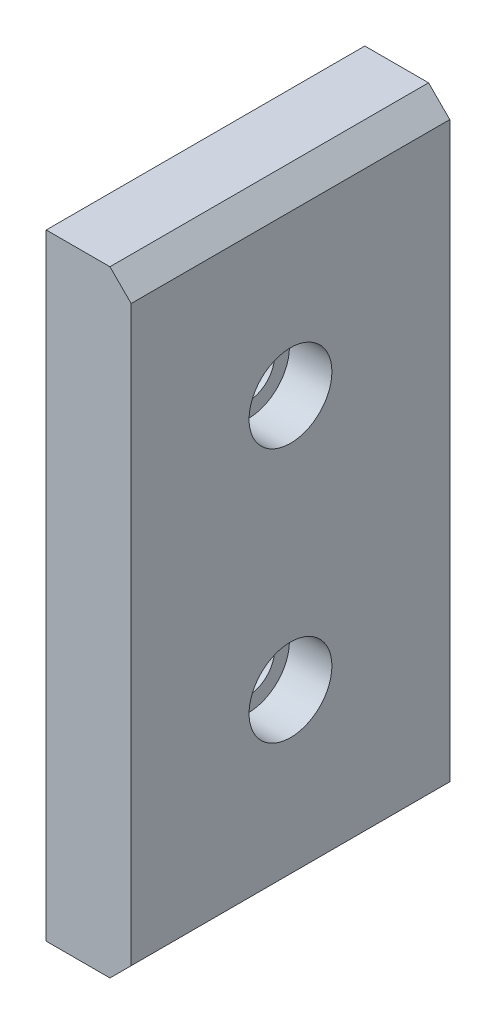
ISO-10303-21;
HEADER;
FILE_DESCRIPTION(('STEP AP214'),'2;1');
FILE_NAME('part.step','',(''),(''),'','','');
FILE_SCHEMA(('AUTOMOTIVE_DESIGN { 1 0 10303 214 1 1 1 1 }'));
ENDSEC;
DATA;
#1=APPLICATION_CONTEXT('core data for automotive mechanical design processes');
#2=APPLICATION_PROTOCOL_DEFINITION('international standard','automotive_design',2000,#1);
#3=PRODUCT_CONTEXT('',#1,'mechanical');
#4=PRODUCT('Part','Part','',(#3));
#5=PRODUCT_RELATED_PRODUCT_CATEGORY('part','',(#4));
#6=PRODUCT_DEFINITION_FORMATION('','',#4);
#7=PRODUCT_DEFINITION_CONTEXT('part definition',#1,'design');
#8=PRODUCT_DEFINITION('design','',#6,#7);
#9=PRODUCT_DEFINITION_SHAPE('','',#8);
#10=(LENGTH_UNIT() NAMED_UNIT(*) SI_UNIT(.MILLI.,.METRE.));
#11=(NAMED_UNIT(*) PLANE_ANGLE_UNIT() SI_UNIT($,.RADIAN.));
#12=(NAMED_UNIT(*) SI_UNIT($,.STERADIAN.) SOLID_ANGLE_UNIT());
#13=UNCERTAINTY_MEASURE_WITH_UNIT(LENGTH_MEASURE(1.E-05),#10,'distance_accuracy_value','');
#14=(GEOMETRIC_REPRESENTATION_CONTEXT(3) GLOBAL_UNCERTAINTY_ASSIGNED_CONTEXT((#13)) GLOBAL_UNIT_ASSIGNED_CONTEXT((#10,
#11,#12)) REPRESENTATION_CONTEXT('',''));
#15=CARTESIAN_POINT('',(0.,0.,0.));
#16=DIRECTION('',(0.,0.,1.));
#17=DIRECTION('',(1.,0.,0.));
#18=AXIS2_PLACEMENT_3D('',#15,#16,#17);
#19=CARTESIAN_POINT('',(4.,6.,0.));
#20=DIRECTION('',(-1.,0.,0.));
#21=DIRECTION('',(0.,0.,1.));
#22=AXIS2_PLACEMENT_3D('',#19,#20,#21);
#23=CYLINDRICAL_SURFACE('',#22,1.25);
#24=CARTESIAN_POINT('',(0.,6.,0.));
#25=DIRECTION('',(1.,0.,0.));
#26=DIRECTION('',(0.,0.,-1.));
#27=AXIS2_PLACEMENT_3D('',#24,#25,#26);
#28=CIRCLE('',#27,1.25);
#29=CARTESIAN_POINT('',(0.,6.,-1.25));
#30=VERTEX_POINT('',#29);
#31=EDGE_CURVE('E116',#30,#30,#28,.T.);
#32=ORIENTED_EDGE('',*,*,#31,.F.);
#33=EDGE_LOOP('',(#32));
#34=FACE_BOUND('',#33,.T.);
#35=CARTESIAN_POINT('',(2.,6.,0.));
#36=DIRECTION('',(1.,0.,0.));
#37=DIRECTION('',(0.,0.,-1.));
#38=AXIS2_PLACEMENT_3D('',#35,#36,#37);
#39=CIRCLE('',#38,1.25);
#40=CARTESIAN_POINT('',(2.,6.,-1.25));
#41=VERTEX_POINT('',#40);
#42=EDGE_CURVE('E136',#41,#41,#39,.T.);
#43=ORIENTED_EDGE('',*,*,#42,.T.);
#44=EDGE_LOOP('',(#43));
#45=FACE_BOUND('',#44,.T.);
#46=ADVANCED_FACE('F37',(#34,#45),#23,.F.);
#47=CARTESIAN_POINT('',(4.,-6.,0.));
#48=DIRECTION('',(-1.,0.,0.));
#49=DIRECTION('',(0.,0.,1.));
#50=AXIS2_PLACEMENT_3D('',#47,#48,#49);
#51=CYLINDRICAL_SURFACE('',#50,1.25);
#52=CARTESIAN_POINT('',(0.,-6.,0.));
#53=DIRECTION('',(1.,0.,0.));
#54=DIRECTION('',(0.,0.,1.));
#55=AXIS2_PLACEMENT_3D('',#52,#53,#54);
#56=CIRCLE('',#55,1.25);
#57=CARTESIAN_POINT('',(0.,-6.,1.25));
#58=VERTEX_POINT('',#57);
#59=EDGE_CURVE('E119',#58,#58,#56,.T.);
#60=ORIENTED_EDGE('',*,*,#59,.F.);
#61=EDGE_LOOP('',(#60));
#62=FACE_BOUND('',#61,.T.);
#63=CARTESIAN_POINT('',(2.,-6.,0.));
#64=DIRECTION('',(1.,0.,0.));
#65=DIRECTION('',(0.,0.,-1.));
#66=AXIS2_PLACEMENT_3D('',#63,#64,#65);
#67=CIRCLE('',#66,1.25);
#68=CARTESIAN_POINT('',(2.,-6.,-1.25));
#69=VERTEX_POINT('',#68);
#70=EDGE_CURVE('E133',#69,#69,#67,.T.);
#71=ORIENTED_EDGE('',*,*,#70,.T.);
#72=EDGE_LOOP('',(#71));
#73=FACE_BOUND('',#72,.T.);
#74=ADVANCED_FACE('F188',(#62,#73),#51,.F.);
#75=CARTESIAN_POINT('',(4.,0.,0.));
#76=DIRECTION('',(1.,0.,0.));
#77=DIRECTION('',(0.,0.,-1.));
#78=AXIS2_PLACEMENT_3D('',#75,#76,#77);
#79=PLANE('',#78);
#80=CARTESIAN_POINT('',(4.,6.,0.));
#81=DIRECTION('',(1.,0.,0.));
#82=DIRECTION('',(0.,0.,-1.));
#83=AXIS2_PLACEMENT_3D('',#80,#81,#82);
#84=CIRCLE('',#83,1.95);
#85=CARTESIAN_POINT('',(4.,6.,-1.95));
#86=VERTEX_POINT('',#85);
#87=EDGE_CURVE('E171',#86,#86,#84,.T.);
#88=ORIENTED_EDGE('',*,*,#87,.F.);
#89=EDGE_LOOP('',(#88));
#90=FACE_BOUND('',#89,.T.);
#91=CARTESIAN_POINT('',(4.,-6.,0.));
#92=DIRECTION('',(1.,0.,0.));
#93=DIRECTION('',(0.,0.,-1.));
#94=AXIS2_PLACEMENT_3D('',#91,#92,#93);
#95=CIRCLE('',#94,1.95);
#96=CARTESIAN_POINT('',(4.,-6.,-1.95));
#97=VERTEX_POINT('',#96);
#98=EDGE_CURVE('E165',#97,#97,#95,.T.);
#99=ORIENTED_EDGE('',*,*,#98,.F.);
#100=EDGE_LOOP('',(#99));
#101=FACE_BOUND('',#100,.T.);
#102=DIRECTION('',(0.,-1.,0.));
#103=VECTOR('',#102,1.);
#104=CARTESIAN_POINT('',(4.,14.5,7.5));
#105=LINE('',#104,#103);
#106=CARTESIAN_POINT('',(4.,13.5,7.5));
#107=VERTEX_POINT('',#106);
#108=CARTESIAN_POINT('',(4.,-13.5,7.5));
#109=VERTEX_POINT('',#108);
#110=EDGE_CURVE('E122',#107,#109,#105,.T.);
#111=ORIENTED_EDGE('',*,*,#110,.T.);
#112=DIRECTION('',(0.,0.,-1.));
#113=VECTOR('',#112,1.);
#114=CARTESIAN_POINT('',(4.,-13.5,-7.5));
#115=LINE('',#114,#113);
#116=CARTESIAN_POINT('',(4.,-13.5,-7.5));
#117=VERTEX_POINT('',#116);
#118=EDGE_CURVE('E142',#109,#117,#115,.T.);
#119=ORIENTED_EDGE('',*,*,#118,.T.);
#120=DIRECTION('',(0.,1.,0.));
#121=VECTOR('',#120,1.);
#122=CARTESIAN_POINT('',(4.,14.5,-7.5));
#123=LINE('',#122,#121);
#124=CARTESIAN_POINT('',(4.,13.5,-7.5));
#125=VERTEX_POINT('',#124);
#126=EDGE_CURVE('E128',#117,#125,#123,.T.);
#127=ORIENTED_EDGE('',*,*,#126,.T.);
#128=DIRECTION('',(0.,0.,1.));
#129=VECTOR('',#128,1.);
#130=CARTESIAN_POINT('',(4.,13.5,7.5));
#131=LINE('',#130,#129);
#132=EDGE_CURVE('E100',#125,#107,#131,.T.);
#133=ORIENTED_EDGE('',*,*,#132,.T.);
#134=EDGE_LOOP('',(#111,#119,#127,#133));
#135=FACE_BOUND('',#134,.T.);
#136=ADVANCED_FACE('F156',(#90,#101,#135),#79,.T.);
#137=CARTESIAN_POINT('',(0.,0.,0.));
#138=DIRECTION('',(1.,0.,0.));
#139=DIRECTION('',(0.,0.,-1.));
#140=AXIS2_PLACEMENT_3D('',#137,#138,#139);
#141=PLANE('',#140);
#142=DIRECTION('',(0.,1.,0.));
#143=VECTOR('',#142,1.);
#144=CARTESIAN_POINT('',(0.,14.5,-7.5));
#145=LINE('',#144,#143);
#146=CARTESIAN_POINT('',(0.,-14.5,-7.5));
#147=VERTEX_POINT('',#146);
#148=CARTESIAN_POINT('',(0.,14.5,-7.5));
#149=VERTEX_POINT('',#148);
#150=EDGE_CURVE('E108',#147,#149,#145,.T.);
#151=ORIENTED_EDGE('',*,*,#150,.F.);
#152=DIRECTION('',(0.,0.,-1.));
#153=VECTOR('',#152,1.);
#154=CARTESIAN_POINT('',(0.,-14.5,7.5));
#155=LINE('',#154,#153);
#156=CARTESIAN_POINT('',(0.,-14.5,7.5));
#157=VERTEX_POINT('',#156);
#158=EDGE_CURVE('E126',#157,#147,#155,.T.);
#159=ORIENTED_EDGE('',*,*,#158,.F.);
#160=DIRECTION('',(0.,-1.,0.));
#161=VECTOR('',#160,1.);
#162=CARTESIAN_POINT('',(0.,14.5,7.5));
#163=LINE('',#162,#161);
#164=CARTESIAN_POINT('',(0.,14.5,7.5));
#165=VERTEX_POINT('',#164);
#166=EDGE_CURVE('E110',#165,#157,#163,.T.);
#167=ORIENTED_EDGE('',*,*,#166,.F.);
#168=DIRECTION('',(0.,0.,1.));
#169=VECTOR('',#168,1.);
#170=CARTESIAN_POINT('',(0.,14.5,7.5));
#171=LINE('',#170,#169);
#172=EDGE_CURVE('E94',#149,#165,#171,.T.);
#173=ORIENTED_EDGE('',*,*,#172,.F.);
#174=EDGE_LOOP('',(#151,#159,#167,#173));
#175=FACE_BOUND('',#174,.T.);
#176=ORIENTED_EDGE('',*,*,#31,.T.);
#177=EDGE_LOOP('',(#176));
#178=FACE_BOUND('',#177,.T.);
#179=ORIENTED_EDGE('',*,*,#59,.T.);
#180=EDGE_LOOP('',(#179));
#181=FACE_BOUND('',#180,.T.);
#182=ADVANCED_FACE('F105',(#175,#178,#181),#141,.F.);
#183=CARTESIAN_POINT('',(4.,14.5,-7.5));
#184=DIRECTION('',(0.,0.,1.));
#185=DIRECTION('',(0.,-1.,0.));
#186=AXIS2_PLACEMENT_3D('',#183,#184,#185);
#187=PLANE('',#186);
#188=ORIENTED_EDGE('',*,*,#126,.F.);
#189=DIRECTION('',(-0.707106781186549,-0.707106781186546,0.));
#190=VECTOR('',#189,1.);
#191=CARTESIAN_POINT('',(4.,-13.5,-7.5));
#192=LINE('',#191,#190);
#193=CARTESIAN_POINT('',(3.,-14.5,-7.5));
#194=VERTEX_POINT('',#193);
#195=EDGE_CURVE('E147',#117,#194,#192,.T.);
#196=ORIENTED_EDGE('',*,*,#195,.T.);
#197=DIRECTION('',(-1.,0.,0.));
#198=VECTOR('',#197,1.);
#199=CARTESIAN_POINT('',(4.,-14.5,-7.5));
#200=LINE('',#199,#198);
#201=EDGE_CURVE('E114',#194,#147,#200,.T.);
#202=ORIENTED_EDGE('',*,*,#201,.T.);
#203=ORIENTED_EDGE('',*,*,#150,.T.);
#204=DIRECTION('',(-1.,0.,0.));
#205=VECTOR('',#204,1.);
#206=CARTESIAN_POINT('',(4.,14.5,-7.5));
#207=LINE('',#206,#205);
#208=CARTESIAN_POINT('',(3.,14.5,-7.5));
#209=VERTEX_POINT('',#208);
#210=EDGE_CURVE('E91',#209,#149,#207,.T.);
#211=ORIENTED_EDGE('',*,*,#210,.F.);
#212=DIRECTION('',(0.707106781186549,-0.707106781186546,0.));
#213=VECTOR('',#212,1.);
#214=CARTESIAN_POINT('',(4.,13.5,-7.5));
#215=LINE('',#214,#213);
#216=EDGE_CURVE('E145',#209,#125,#215,.T.);
#217=ORIENTED_EDGE('',*,*,#216,.T.);
#218=EDGE_LOOP('',(#188,#196,#202,#203,#211,#217));
#219=FACE_BOUND('',#218,.T.);
#220=ADVANCED_FACE('F113',(#219),#187,.F.);
#221=CARTESIAN_POINT('',(4.,14.5,7.5));
#222=DIRECTION('',(0.,-1.,0.));
#223=DIRECTION('',(0.,0.,-1.));
#224=AXIS2_PLACEMENT_3D('',#221,#222,#223);
#225=PLANE('',#224);
#226=DIRECTION('',(-1.,0.,0.));
#227=VECTOR('',#226,1.);
#228=CARTESIAN_POINT('',(4.,14.5,7.5));
#229=LINE('',#228,#227);
#230=CARTESIAN_POINT('',(3.,14.5,7.5));
#231=VERTEX_POINT('',#230);
#232=EDGE_CURVE('E101',#231,#165,#229,.T.);
#233=ORIENTED_EDGE('',*,*,#232,.F.);
#234=DIRECTION('',(0.,0.,-1.));
#235=VECTOR('',#234,1.);
#236=CARTESIAN_POINT('',(3.,14.5,-7.5));
#237=LINE('',#236,#235);
#238=EDGE_CURVE('E11',#231,#209,#237,.T.);
#239=ORIENTED_EDGE('',*,*,#238,.T.);
#240=ORIENTED_EDGE('',*,*,#210,.T.);
#241=ORIENTED_EDGE('',*,*,#172,.T.);
#242=EDGE_LOOP('',(#233,#239,#240,#241));
#243=FACE_BOUND('',#242,.T.);
#244=ADVANCED_FACE('F93',(#243),#225,.F.);
#245=CARTESIAN_POINT('',(4.,14.5,7.5));
#246=DIRECTION('',(0.,0.,-1.));
#247=DIRECTION('',(0.,1.,0.));
#248=AXIS2_PLACEMENT_3D('',#245,#246,#247);
#249=PLANE('',#248);
#250=DIRECTION('',(-1.,0.,0.));
#251=VECTOR('',#250,1.);
#252=CARTESIAN_POINT('',(4.,-14.5,7.5));
#253=LINE('',#252,#251);
#254=CARTESIAN_POINT('',(3.,-14.5,7.5));
#255=VERTEX_POINT('',#254);
#256=EDGE_CURVE('E130',#255,#157,#253,.T.);
#257=ORIENTED_EDGE('',*,*,#256,.F.);
#258=DIRECTION('',(0.707106781186549,0.707106781186546,0.));
#259=VECTOR('',#258,1.);
#260=CARTESIAN_POINT('',(4.,-13.5,7.5));
#261=LINE('',#260,#259);
#262=EDGE_CURVE('E46',#255,#109,#261,.T.);
#263=ORIENTED_EDGE('',*,*,#262,.T.);
#264=ORIENTED_EDGE('',*,*,#110,.F.);
#265=DIRECTION('',(-0.707106781186549,0.707106781186546,0.));
#266=VECTOR('',#265,1.);
#267=CARTESIAN_POINT('',(4.,13.5,7.5));
#268=LINE('',#267,#266);
#269=EDGE_CURVE('E53',#107,#231,#268,.T.);
#270=ORIENTED_EDGE('',*,*,#269,.T.);
#271=ORIENTED_EDGE('',*,*,#232,.T.);
#272=ORIENTED_EDGE('',*,*,#166,.T.);
#273=EDGE_LOOP('',(#257,#263,#264,#270,#271,#272));
#274=FACE_BOUND('',#273,.T.);
#275=ADVANCED_FACE('F152',(#274),#249,.F.);
#276=CARTESIAN_POINT('',(4.,-14.5,7.5));
#277=DIRECTION('',(0.,1.,0.));
#278=DIRECTION('',(0.,0.,1.));
#279=AXIS2_PLACEMENT_3D('',#276,#277,#278);
#280=PLANE('',#279);
#281=ORIENTED_EDGE('',*,*,#201,.F.);
#282=DIRECTION('',(0.,0.,1.));
#283=VECTOR('',#282,1.);
#284=CARTESIAN_POINT('',(3.,-14.5,7.5));
#285=LINE('',#284,#283);
#286=EDGE_CURVE('E61',#194,#255,#285,.T.);
#287=ORIENTED_EDGE('',*,*,#286,.T.);
#288=ORIENTED_EDGE('',*,*,#256,.T.);
#289=ORIENTED_EDGE('',*,*,#158,.T.);
#290=EDGE_LOOP('',(#281,#287,#288,#289));
#291=FACE_BOUND('',#290,.T.);
#292=ADVANCED_FACE('F160',(#291),#280,.F.);
#293=CARTESIAN_POINT('',(2.,-6.,0.));
#294=DIRECTION('',(1.,0.,0.));
#295=DIRECTION('',(0.,0.,-1.));
#296=AXIS2_PLACEMENT_3D('',#293,#294,#295);
#297=CYLINDRICAL_SURFACE('',#296,1.95);
#298=CARTESIAN_POINT('',(2.,-6.,0.));
#299=DIRECTION('',(1.,0.,0.));
#300=DIRECTION('',(0.,0.,-1.));
#301=AXIS2_PLACEMENT_3D('',#298,#299,#300);
#302=CIRCLE('',#301,1.95);
#303=CARTESIAN_POINT('',(2.,-6.,-1.95));
#304=VERTEX_POINT('',#303);
#305=EDGE_CURVE('E168',#304,#304,#302,.T.);
#306=ORIENTED_EDGE('',*,*,#305,.F.);
#307=EDGE_LOOP('',(#306));
#308=FACE_BOUND('',#307,.T.);
#309=ORIENTED_EDGE('',*,*,#98,.T.);
#310=EDGE_LOOP('',(#309));
#311=FACE_BOUND('',#310,.T.);
#312=ADVANCED_FACE('F192',(#308,#311),#297,.F.);
#313=CARTESIAN_POINT('',(2.,-6.,0.));
#314=DIRECTION('',(1.,0.,0.));
#315=DIRECTION('',(0.,0.,-1.));
#316=AXIS2_PLACEMENT_3D('',#313,#314,#315);
#317=PLANE('',#316);
#318=ORIENTED_EDGE('',*,*,#70,.F.);
#319=EDGE_LOOP('',(#318));
#320=FACE_BOUND('',#319,.T.);
#321=ORIENTED_EDGE('',*,*,#305,.T.);
#322=EDGE_LOOP('',(#321));
#323=FACE_BOUND('',#322,.T.);
#324=ADVANCED_FACE('F182',(#320,#323),#317,.T.);
#325=CARTESIAN_POINT('',(2.,6.,0.));
#326=DIRECTION('',(1.,0.,0.));
#327=DIRECTION('',(0.,0.,-1.));
#328=AXIS2_PLACEMENT_3D('',#325,#326,#327);
#329=CYLINDRICAL_SURFACE('',#328,1.95);
#330=CARTESIAN_POINT('',(2.,6.,0.));
#331=DIRECTION('',(1.,0.,0.));
#332=DIRECTION('',(0.,0.,-1.));
#333=AXIS2_PLACEMENT_3D('',#330,#331,#332);
#334=CIRCLE('',#333,1.95);
#335=CARTESIAN_POINT('',(2.,6.,-1.95));
#336=VERTEX_POINT('',#335);
#337=EDGE_CURVE('E137',#336,#336,#334,.T.);
#338=ORIENTED_EDGE('',*,*,#337,.F.);
#339=EDGE_LOOP('',(#338));
#340=FACE_BOUND('',#339,.T.);
#341=ORIENTED_EDGE('',*,*,#87,.T.);
#342=EDGE_LOOP('',(#341));
#343=FACE_BOUND('',#342,.T.);
#344=ADVANCED_FACE('F179',(#340,#343),#329,.F.);
#345=CARTESIAN_POINT('',(2.,6.,0.));
#346=DIRECTION('',(1.,0.,0.));
#347=DIRECTION('',(0.,0.,-1.));
#348=AXIS2_PLACEMENT_3D('',#345,#346,#347);
#349=PLANE('',#348);
#350=ORIENTED_EDGE('',*,*,#42,.F.);
#351=EDGE_LOOP('',(#350));
#352=FACE_BOUND('',#351,.T.);
#353=ORIENTED_EDGE('',*,*,#337,.T.);
#354=EDGE_LOOP('',(#353));
#355=FACE_BOUND('',#354,.T.);
#356=ADVANCED_FACE('F177',(#352,#355),#349,.T.);
#357=CARTESIAN_POINT('',(4.,-13.5,0.));
#358=DIRECTION('',(0.707106781186546,-0.707106781186549,0.));
#359=DIRECTION('',(0.,0.,1.));
#360=AXIS2_PLACEMENT_3D('',#357,#358,#359);
#361=PLANE('',#360);
#362=ORIENTED_EDGE('',*,*,#262,.F.);
#363=ORIENTED_EDGE('',*,*,#286,.F.);
#364=ORIENTED_EDGE('',*,*,#195,.F.);
#365=ORIENTED_EDGE('',*,*,#118,.F.);
#366=EDGE_LOOP('',(#362,#363,#364,#365));
#367=FACE_BOUND('',#366,.T.);
#368=ADVANCED_FACE('F159',(#367),#361,.T.);
#369=CARTESIAN_POINT('',(4.,13.5,0.));
#370=DIRECTION('',(0.707106781186546,0.707106781186549,0.));
#371=DIRECTION('',(0.,0.,-1.));
#372=AXIS2_PLACEMENT_3D('',#369,#370,#371);
#373=PLANE('',#372);
#374=ORIENTED_EDGE('',*,*,#216,.F.);
#375=ORIENTED_EDGE('',*,*,#238,.F.);
#376=ORIENTED_EDGE('',*,*,#269,.F.);
#377=ORIENTED_EDGE('',*,*,#132,.F.);
#378=EDGE_LOOP('',(#374,#375,#376,#377));
#379=FACE_BOUND('',#378,.T.);
#380=ADVANCED_FACE('F40',(#379),#373,.T.);
#381=CLOSED_SHELL('',(#46,#74,#136,#182,#220,#244,#275,#292,#312,#324,#344,#356,#368,#380));
#382=MANIFOLD_SOLID_BREP('B2',#381);
#383=ADVANCED_BREP_SHAPE_REPRESENTATION('',(#18,#382),#14);
#384=SHAPE_DEFINITION_REPRESENTATION(#9,#383);
ENDSEC;
END-ISO-10303-21;
